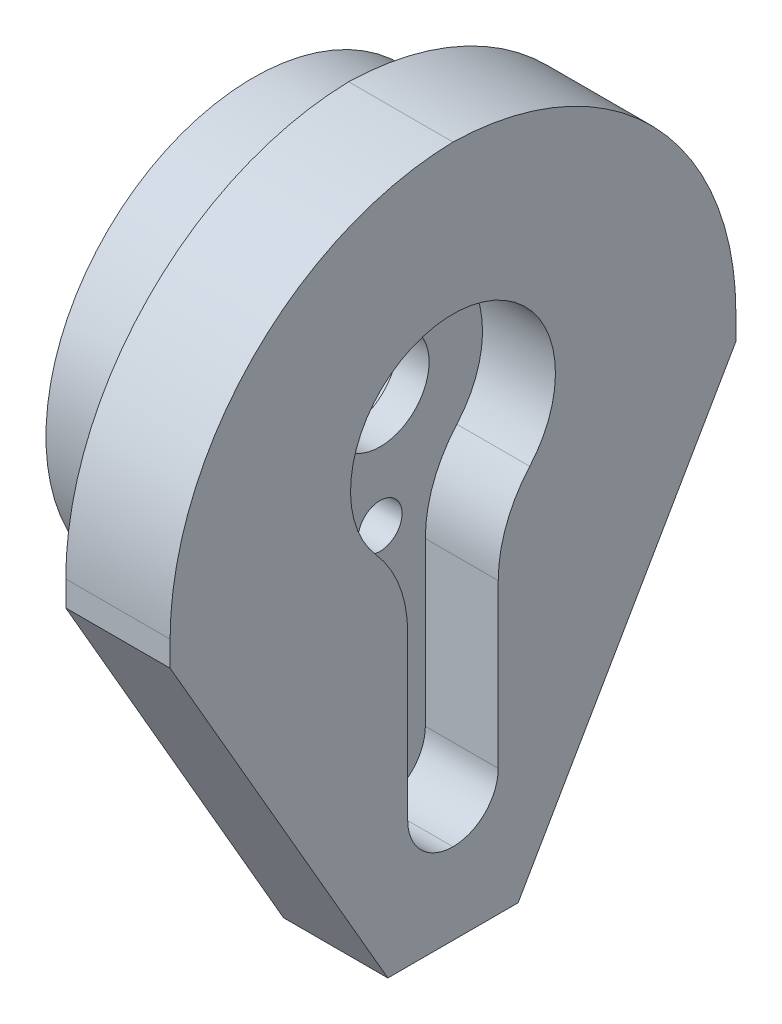
ISO-10303-21;
HEADER;
FILE_DESCRIPTION(('STEP AP214'),'2;1');
FILE_NAME('part.step','',(''),(''),'','','');
FILE_SCHEMA(('AUTOMOTIVE_DESIGN { 1 0 10303 214 1 1 1 1 }'));
ENDSEC;
DATA;
#1=APPLICATION_CONTEXT('core data for automotive mechanical design processes');
#2=APPLICATION_PROTOCOL_DEFINITION('international standard','automotive_design',2000,#1);
#3=PRODUCT_CONTEXT('',#1,'mechanical');
#4=PRODUCT('Part','Part','',(#3));
#5=PRODUCT_RELATED_PRODUCT_CATEGORY('part','',(#4));
#6=PRODUCT_DEFINITION_FORMATION('','',#4);
#7=PRODUCT_DEFINITION_CONTEXT('part definition',#1,'design');
#8=PRODUCT_DEFINITION('design','',#6,#7);
#9=PRODUCT_DEFINITION_SHAPE('','',#8);
#10=(LENGTH_UNIT() NAMED_UNIT(*) SI_UNIT(.MILLI.,.METRE.));
#11=(NAMED_UNIT(*) PLANE_ANGLE_UNIT() SI_UNIT($,.RADIAN.));
#12=(NAMED_UNIT(*) SI_UNIT($,.STERADIAN.) SOLID_ANGLE_UNIT());
#13=UNCERTAINTY_MEASURE_WITH_UNIT(LENGTH_MEASURE(1.E-05),#10,'distance_accuracy_value','');
#14=(GEOMETRIC_REPRESENTATION_CONTEXT(3) GLOBAL_UNCERTAINTY_ASSIGNED_CONTEXT((#13)) GLOBAL_UNIT_ASSIGNED_CONTEXT((#10,
#11,#12)) REPRESENTATION_CONTEXT('',''));
#15=CARTESIAN_POINT('',(0.,0.,0.));
#16=DIRECTION('',(0.,0.,1.));
#17=DIRECTION('',(1.,0.,0.));
#18=AXIS2_PLACEMENT_3D('',#15,#16,#17);
#19=CARTESIAN_POINT('',(20.,0.,0.));
#20=DIRECTION('',(1.,0.,0.));
#21=DIRECTION('',(0.,0.,-1.));
#22=AXIS2_PLACEMENT_3D('',#19,#20,#21);
#23=PLANE('',#22);
#24=CARTESIAN_POINT('',(20.,0.,0.));
#25=DIRECTION('',(1.,0.,0.));
#26=DIRECTION('',(0.,0.,-1.));
#27=AXIS2_PLACEMENT_3D('',#24,#25,#26);
#28=CIRCLE('',#27,17.475);
#29=CARTESIAN_POINT('',(20.,0.,-17.475));
#30=VERTEX_POINT('',#29);
#31=EDGE_CURVE('E11',#30,#30,#28,.T.);
#32=ORIENTED_EDGE('',*,*,#31,.T.);
#33=EDGE_LOOP('',(#32));
#34=FACE_BOUND('',#33,.T.);
#35=CARTESIAN_POINT('',(20.,-20.6,0.));
#36=DIRECTION('',(1.,0.,0.));
#37=DIRECTION('',(0.,0.,-1.));
#38=AXIS2_PLACEMENT_3D('',#35,#36,#37);
#39=CIRCLE('',#38,1.75);
#40=CARTESIAN_POINT('',(20.,-20.6,-1.75));
#41=VERTEX_POINT('',#40);
#42=EDGE_CURVE('E231',#41,#41,#39,.F.);
#43=ORIENTED_EDGE('',*,*,#42,.F.);
#44=EDGE_LOOP('',(#43));
#45=FACE_BOUND('',#44,.T.);
#46=DIRECTION('',(0.,1.,0.));
#47=VECTOR('',#46,1.);
#48=CARTESIAN_POINT('',(20.,35.,-22.5));
#49=LINE('',#48,#47);
#50=CARTESIAN_POINT('',(20.,-4.99999999999982,-22.5));
#51=VERTEX_POINT('',#50);
#52=CARTESIAN_POINT('',(20.,-3.,-22.5));
#53=VERTEX_POINT('',#52);
#54=EDGE_CURVE('E387',#51,#53,#49,.T.);
#55=ORIENTED_EDGE('',*,*,#54,.F.);
#56=DIRECTION('',(0.,0.86602540378444,-0.499999999999998));
#57=VECTOR('',#56,1.);
#58=CARTESIAN_POINT('',(20.,-4.99999999999982,-22.5));
#59=LINE('',#58,#57);
#60=CARTESIAN_POINT('',(20.,-35.,-5.17949192431122));
#61=VERTEX_POINT('',#60);
#62=EDGE_CURVE('E71',#51,#61,#59,.F.);
#63=ORIENTED_EDGE('',*,*,#62,.T.);
#64=DIRECTION('',(0.,0.,-1.));
#65=VECTOR('',#64,1.);
#66=CARTESIAN_POINT('',(20.,-35.,22.5));
#67=LINE('',#66,#65);
#68=CARTESIAN_POINT('',(20.,-35.,5.17949192431122));
#69=VERTEX_POINT('',#68);
#70=EDGE_CURVE('E191',#69,#61,#67,.T.);
#71=ORIENTED_EDGE('',*,*,#70,.F.);
#72=DIRECTION('',(0.,-0.86602540378444,-0.499999999999998));
#73=VECTOR('',#72,1.);
#74=CARTESIAN_POINT('',(20.,-35.,5.17949192431121));
#75=LINE('',#74,#73);
#76=CARTESIAN_POINT('',(20.,-4.99999999999984,22.5));
#77=VERTEX_POINT('',#76);
#78=EDGE_CURVE('E261',#69,#77,#75,.F.);
#79=ORIENTED_EDGE('',*,*,#78,.T.);
#80=DIRECTION('',(0.,-1.,0.));
#81=VECTOR('',#80,1.);
#82=CARTESIAN_POINT('',(20.,35.,22.5));
#83=LINE('',#82,#81);
#84=CARTESIAN_POINT('',(20.,-3.,22.5));
#85=VERTEX_POINT('',#84);
#86=EDGE_CURVE('E382',#85,#77,#83,.T.);
#87=ORIENTED_EDGE('',*,*,#86,.F.);
#88=CARTESIAN_POINT('',(20.,-3.,-0.500000000000001));
#89=DIRECTION('',(1.,0.,0.));
#90=DIRECTION('',(0.,0.,-1.));
#91=AXIS2_PLACEMENT_3D('',#88,#89,#90);
#92=CIRCLE('',#91,23.);
#93=CARTESIAN_POINT('',(20.,19.9945645751338,0.));
#94=VERTEX_POINT('',#93);
#95=EDGE_CURVE('E227',#85,#94,#92,.F.);
#96=ORIENTED_EDGE('',*,*,#95,.T.);
#97=CARTESIAN_POINT('',(20.,-3.,0.499999999999993));
#98=DIRECTION('',(1.,0.,0.));
#99=DIRECTION('',(0.,0.,-1.));
#100=AXIS2_PLACEMENT_3D('',#97,#98,#99);
#101=CIRCLE('',#100,23.);
#102=EDGE_CURVE('E234',#94,#53,#101,.F.);
#103=ORIENTED_EDGE('',*,*,#102,.T.);
#104=EDGE_LOOP('',(#55,#63,#71,#79,#87,#96,#103));
#105=FACE_BOUND('',#104,.T.);
#106=ADVANCED_FACE('F47',(#34,#45,#105),#23,.F.);
#107=CARTESIAN_POINT('',(28.3,35.,-22.5));
#108=DIRECTION('',(0.,0.,1.));
#109=DIRECTION('',(0.,-1.,0.));
#110=AXIS2_PLACEMENT_3D('',#107,#108,#109);
#111=PLANE('',#110);
#112=DIRECTION('',(0.,1.,0.));
#113=VECTOR('',#112,1.);
#114=CARTESIAN_POINT('',(28.3,35.,-22.5));
#115=LINE('',#114,#113);
#116=CARTESIAN_POINT('',(28.3,-4.99999999999982,-22.5));
#117=VERTEX_POINT('',#116);
#118=CARTESIAN_POINT('',(28.3,-3.,-22.5));
#119=VERTEX_POINT('',#118);
#120=EDGE_CURVE('E373',#117,#119,#115,.T.);
#121=ORIENTED_EDGE('',*,*,#120,.F.);
#122=DIRECTION('',(-1.,0.,0.));
#123=VECTOR('',#122,1.);
#124=CARTESIAN_POINT('',(28.3,-4.99999999999982,-22.5));
#125=LINE('',#124,#123);
#126=EDGE_CURVE('E270',#117,#51,#125,.T.);
#127=ORIENTED_EDGE('',*,*,#126,.T.);
#128=ORIENTED_EDGE('',*,*,#54,.T.);
#129=DIRECTION('',(-1.,0.,0.));
#130=VECTOR('',#129,1.);
#131=CARTESIAN_POINT('',(28.3,-3.,-22.5));
#132=LINE('',#131,#130);
#133=EDGE_CURVE('E238',#53,#119,#132,.F.);
#134=ORIENTED_EDGE('',*,*,#133,.T.);
#135=EDGE_LOOP('',(#121,#127,#128,#134));
#136=FACE_BOUND('',#135,.T.);
#137=ADVANCED_FACE('F305',(#136),#111,.F.);
#138=CARTESIAN_POINT('',(28.3,35.,22.5));
#139=DIRECTION('',(0.,0.,-1.));
#140=DIRECTION('',(0.,1.,0.));
#141=AXIS2_PLACEMENT_3D('',#138,#139,#140);
#142=PLANE('',#141);
#143=ORIENTED_EDGE('',*,*,#86,.T.);
#144=DIRECTION('',(1.,0.,0.));
#145=VECTOR('',#144,1.);
#146=CARTESIAN_POINT('',(28.3,-4.99999999999984,22.5));
#147=LINE('',#146,#145);
#148=CARTESIAN_POINT('',(28.3,-4.99999999999984,22.5));
#149=VERTEX_POINT('',#148);
#150=EDGE_CURVE('E264',#77,#149,#147,.T.);
#151=ORIENTED_EDGE('',*,*,#150,.T.);
#152=DIRECTION('',(0.,-1.,0.));
#153=VECTOR('',#152,1.);
#154=CARTESIAN_POINT('',(28.3,35.,22.5));
#155=LINE('',#154,#153);
#156=CARTESIAN_POINT('',(28.3,-3.,22.5));
#157=VERTEX_POINT('',#156);
#158=EDGE_CURVE('E188',#157,#149,#155,.T.);
#159=ORIENTED_EDGE('',*,*,#158,.F.);
#160=DIRECTION('',(1.,0.,0.));
#161=VECTOR('',#160,1.);
#162=CARTESIAN_POINT('',(20.,-3.,22.5));
#163=LINE('',#162,#161);
#164=EDGE_CURVE('E248',#157,#85,#163,.F.);
#165=ORIENTED_EDGE('',*,*,#164,.T.);
#166=EDGE_LOOP('',(#143,#151,#159,#165));
#167=FACE_BOUND('',#166,.T.);
#168=ADVANCED_FACE('F313',(#167),#142,.F.);
#169=CARTESIAN_POINT('',(28.3,0.,0.));
#170=DIRECTION('',(1.,0.,0.));
#171=DIRECTION('',(0.,0.,-1.));
#172=AXIS2_PLACEMENT_3D('',#169,#170,#171);
#173=PLANE('',#172);
#174=DIRECTION('',(0.,-1.,0.));
#175=VECTOR('',#174,1.);
#176=CARTESIAN_POINT('',(28.3,-28.55,3.60000000000001));
#177=LINE('',#176,#175);
#178=CARTESIAN_POINT('',(28.3,-12.0192553845902,3.6));
#179=VERTEX_POINT('',#178);
#180=CARTESIAN_POINT('',(28.3,-24.95,3.60000000000001));
#181=VERTEX_POINT('',#180);
#182=EDGE_CURVE('E152',#179,#181,#177,.T.);
#183=ORIENTED_EDGE('',*,*,#182,.F.);
#184=CARTESIAN_POINT('',(28.3,-12.0192553845902,13.6));
#185=DIRECTION('',(1.,0.,0.));
#186=DIRECTION('',(0.,0.,-1.));
#187=AXIS2_PLACEMENT_3D('',#184,#185,#186);
#188=CIRCLE('',#187,10.);
#189=CARTESIAN_POINT('',(28.3,-5.39707610933388,6.1068870523416));
#190=VERTEX_POINT('',#189);
#191=EDGE_CURVE('E208',#179,#190,#188,.T.);
#192=ORIENTED_EDGE('',*,*,#191,.T.);
#193=CARTESIAN_POINT('',(28.3,0.,0.));
#194=DIRECTION('',(1.,0.,0.));
#195=DIRECTION('',(0.,0.,-1.));
#196=AXIS2_PLACEMENT_3D('',#193,#194,#195);
#197=CIRCLE('',#196,8.15);
#198=CARTESIAN_POINT('',(28.3,-5.39707610933388,-6.1068870523416));
#199=VERTEX_POINT('',#198);
#200=EDGE_CURVE('E384',#199,#190,#197,.T.);
#201=ORIENTED_EDGE('',*,*,#200,.F.);
#202=CARTESIAN_POINT('',(28.3,-12.0192553845902,-13.6));
#203=DIRECTION('',(1.,0.,0.));
#204=DIRECTION('',(0.,0.,-1.));
#205=AXIS2_PLACEMENT_3D('',#202,#203,#204);
#206=CIRCLE('',#205,10.);
#207=CARTESIAN_POINT('',(28.3,-12.0192553845902,-3.6));
#208=VERTEX_POINT('',#207);
#209=EDGE_CURVE('E205',#199,#208,#206,.T.);
#210=ORIENTED_EDGE('',*,*,#209,.T.);
#211=DIRECTION('',(0.,1.,0.));
#212=VECTOR('',#211,1.);
#213=CARTESIAN_POINT('',(28.3,-28.55,-3.59999999999999));
#214=LINE('',#213,#212);
#215=CARTESIAN_POINT('',(28.3,-24.95,-3.59999999999999));
#216=VERTEX_POINT('',#215);
#217=EDGE_CURVE('E162',#216,#208,#214,.T.);
#218=ORIENTED_EDGE('',*,*,#217,.F.);
#219=CARTESIAN_POINT('',(28.3,-24.95,0.));
#220=DIRECTION('',(1.,0.,0.));
#221=DIRECTION('',(0.,0.,-1.));
#222=AXIS2_PLACEMENT_3D('',#219,#220,#221);
#223=CIRCLE('',#222,3.6);
#224=CARTESIAN_POINT('',(28.3,-28.55,0.));
#225=VERTEX_POINT('',#224);
#226=EDGE_CURVE('E171',#216,#225,#223,.F.);
#227=ORIENTED_EDGE('',*,*,#226,.T.);
#228=CARTESIAN_POINT('',(28.3,-24.95,0.));
#229=DIRECTION('',(1.,0.,0.));
#230=DIRECTION('',(0.,0.,-1.));
#231=AXIS2_PLACEMENT_3D('',#228,#229,#230);
#232=CIRCLE('',#231,3.6);
#233=EDGE_CURVE('E166',#225,#181,#232,.F.);
#234=ORIENTED_EDGE('',*,*,#233,.T.);
#235=EDGE_LOOP('',(#183,#192,#201,#210,#218,#227,#234));
#236=FACE_BOUND('',#235,.T.);
#237=DIRECTION('',(0.,0.,-1.));
#238=VECTOR('',#237,1.);
#239=CARTESIAN_POINT('',(28.3,-35.,22.5));
#240=LINE('',#239,#238);
#241=CARTESIAN_POINT('',(28.3,-35.,5.17949192431122));
#242=VERTEX_POINT('',#241);
#243=CARTESIAN_POINT('',(28.3,-35.,-5.17949192431122));
#244=VERTEX_POINT('',#243);
#245=EDGE_CURVE('E183',#242,#244,#240,.T.);
#246=ORIENTED_EDGE('',*,*,#245,.T.);
#247=DIRECTION('',(0.,-0.86602540378444,0.499999999999998));
#248=VECTOR('',#247,1.);
#249=CARTESIAN_POINT('',(28.3,-10.9927857925748,-19.0400635094611));
#250=LINE('',#249,#248);
#251=EDGE_CURVE('E278',#244,#117,#250,.F.);
#252=ORIENTED_EDGE('',*,*,#251,.T.);
#253=ORIENTED_EDGE('',*,*,#120,.T.);
#254=CARTESIAN_POINT('',(28.3,-3.,0.499999999999993));
#255=DIRECTION('',(1.,0.,0.));
#256=DIRECTION('',(0.,0.,-1.));
#257=AXIS2_PLACEMENT_3D('',#254,#255,#256);
#258=CIRCLE('',#257,23.);
#259=CARTESIAN_POINT('',(28.3,19.9945645751338,0.));
#260=VERTEX_POINT('',#259);
#261=EDGE_CURVE('E245',#119,#260,#258,.T.);
#262=ORIENTED_EDGE('',*,*,#261,.T.);
#263=CARTESIAN_POINT('',(28.3,-3.,-0.500000000000001));
#264=DIRECTION('',(1.,0.,0.));
#265=DIRECTION('',(0.,0.,-1.));
#266=AXIS2_PLACEMENT_3D('',#263,#264,#265);
#267=CIRCLE('',#266,23.);
#268=EDGE_CURVE('E242',#260,#157,#267,.T.);
#269=ORIENTED_EDGE('',*,*,#268,.T.);
#270=ORIENTED_EDGE('',*,*,#158,.T.);
#271=DIRECTION('',(0.,0.86602540378444,0.499999999999998));
#272=VECTOR('',#271,1.);
#273=CARTESIAN_POINT('',(28.3,-10.9927857925749,19.0400635094611));
#274=LINE('',#273,#272);
#275=EDGE_CURVE('E267',#149,#242,#274,.F.);
#276=ORIENTED_EDGE('',*,*,#275,.T.);
#277=EDGE_LOOP('',(#246,#252,#253,#262,#269,#270,#276));
#278=FACE_BOUND('',#277,.T.);
#279=ADVANCED_FACE('F167',(#236,#278),#173,.T.);
#280=CARTESIAN_POINT('',(28.3,-35.,22.5));
#281=DIRECTION('',(0.,1.,0.));
#282=DIRECTION('',(0.,0.,1.));
#283=AXIS2_PLACEMENT_3D('',#280,#281,#282);
#284=PLANE('',#283);
#285=ORIENTED_EDGE('',*,*,#70,.T.);
#286=DIRECTION('',(1.,0.,0.));
#287=VECTOR('',#286,1.);
#288=CARTESIAN_POINT('',(28.3,-35.,-5.17949192431123));
#289=LINE('',#288,#287);
#290=EDGE_CURVE('E63',#61,#244,#289,.T.);
#291=ORIENTED_EDGE('',*,*,#290,.T.);
#292=ORIENTED_EDGE('',*,*,#245,.F.);
#293=DIRECTION('',(-1.,0.,0.));
#294=VECTOR('',#293,1.);
#295=CARTESIAN_POINT('',(28.3,-35.,5.17949192431121));
#296=LINE('',#295,#294);
#297=EDGE_CURVE('E251',#242,#69,#296,.T.);
#298=ORIENTED_EDGE('',*,*,#297,.T.);
#299=EDGE_LOOP('',(#285,#291,#292,#298));
#300=FACE_BOUND('',#299,.T.);
#301=ADVANCED_FACE('F320',(#300),#284,.F.);
#302=CARTESIAN_POINT('',(22.5,-28.55,3.60000000000001));
#303=DIRECTION('',(0.,0.,1.));
#304=DIRECTION('',(0.,-1.,0.));
#305=AXIS2_PLACEMENT_3D('',#302,#303,#304);
#306=PLANE('',#305);
#307=DIRECTION('',(0.,-1.,0.));
#308=VECTOR('',#307,1.);
#309=CARTESIAN_POINT('',(22.5,-28.55,3.60000000000001));
#310=LINE('',#309,#308);
#311=CARTESIAN_POINT('',(22.5,-12.0192553845902,3.6));
#312=VERTEX_POINT('',#311);
#313=CARTESIAN_POINT('',(22.5,-24.95,3.60000000000001));
#314=VERTEX_POINT('',#313);
#315=EDGE_CURVE('E409',#312,#314,#310,.T.);
#316=ORIENTED_EDGE('',*,*,#315,.F.);
#317=DIRECTION('',(1.,0.,0.));
#318=VECTOR('',#317,1.);
#319=CARTESIAN_POINT('',(22.5,-12.0192553845902,3.6));
#320=LINE('',#319,#318);
#321=EDGE_CURVE('E159',#312,#179,#320,.T.);
#322=ORIENTED_EDGE('',*,*,#321,.T.);
#323=ORIENTED_EDGE('',*,*,#182,.T.);
#324=DIRECTION('',(1.,0.,0.));
#325=VECTOR('',#324,1.);
#326=CARTESIAN_POINT('',(22.5,-24.95,3.60000000000001));
#327=LINE('',#326,#325);
#328=EDGE_CURVE('E157',#181,#314,#327,.F.);
#329=ORIENTED_EDGE('',*,*,#328,.T.);
#330=EDGE_LOOP('',(#316,#322,#323,#329));
#331=FACE_BOUND('',#330,.T.);
#332=ADVANCED_FACE('F155',(#331),#306,.F.);
#333=CARTESIAN_POINT('',(22.5,0.,0.));
#334=DIRECTION('',(1.,0.,0.));
#335=DIRECTION('',(0.,0.,-1.));
#336=AXIS2_PLACEMENT_3D('',#333,#334,#335);
#337=CYLINDRICAL_SURFACE('',#336,8.15);
#338=ORIENTED_EDGE('',*,*,#200,.T.);
#339=DIRECTION('',(1.,0.,0.));
#340=VECTOR('',#339,1.);
#341=CARTESIAN_POINT('',(22.5,-5.39707610933388,6.1068870523416));
#342=LINE('',#341,#340);
#343=CARTESIAN_POINT('',(22.5,-5.39707610933388,6.1068870523416));
#344=VERTEX_POINT('',#343);
#345=EDGE_CURVE('E215',#190,#344,#342,.F.);
#346=ORIENTED_EDGE('',*,*,#345,.T.);
#347=CARTESIAN_POINT('',(22.5,0.,0.));
#348=DIRECTION('',(1.,0.,0.));
#349=DIRECTION('',(0.,0.,-1.));
#350=AXIS2_PLACEMENT_3D('',#347,#348,#349);
#351=CIRCLE('',#350,8.15);
#352=CARTESIAN_POINT('',(22.5,-5.39707610933388,-6.1068870523416));
#353=VERTEX_POINT('',#352);
#354=EDGE_CURVE('E389',#353,#344,#351,.T.);
#355=ORIENTED_EDGE('',*,*,#354,.F.);
#356=DIRECTION('',(1.,0.,0.));
#357=VECTOR('',#356,1.);
#358=CARTESIAN_POINT('',(22.5,-5.39707610933388,-6.1068870523416));
#359=LINE('',#358,#357);
#360=EDGE_CURVE('E211',#353,#199,#359,.T.);
#361=ORIENTED_EDGE('',*,*,#360,.T.);
#362=EDGE_LOOP('',(#338,#346,#355,#361));
#363=FACE_BOUND('',#362,.T.);
#364=ADVANCED_FACE('F467',(#363),#337,.F.);
#365=CARTESIAN_POINT('',(22.5,-28.55,-3.59999999999999));
#366=DIRECTION('',(0.,0.,-1.));
#367=DIRECTION('',(0.,1.,0.));
#368=AXIS2_PLACEMENT_3D('',#365,#366,#367);
#369=PLANE('',#368);
#370=ORIENTED_EDGE('',*,*,#217,.T.);
#371=DIRECTION('',(1.,0.,0.));
#372=VECTOR('',#371,1.);
#373=CARTESIAN_POINT('',(22.5,-12.0192553845902,-3.6));
#374=LINE('',#373,#372);
#375=CARTESIAN_POINT('',(22.5,-12.0192553845902,-3.6));
#376=VERTEX_POINT('',#375);
#377=EDGE_CURVE('E218',#208,#376,#374,.F.);
#378=ORIENTED_EDGE('',*,*,#377,.T.);
#379=DIRECTION('',(0.,1.,0.));
#380=VECTOR('',#379,1.);
#381=CARTESIAN_POINT('',(22.5,-28.55,-3.59999999999999));
#382=LINE('',#381,#380);
#383=CARTESIAN_POINT('',(22.5,-24.95,-3.59999999999999));
#384=VERTEX_POINT('',#383);
#385=EDGE_CURVE('E405',#384,#376,#382,.T.);
#386=ORIENTED_EDGE('',*,*,#385,.F.);
#387=DIRECTION('',(1.,0.,0.));
#388=VECTOR('',#387,1.);
#389=CARTESIAN_POINT('',(28.3,-24.95,-3.59999999999999));
#390=LINE('',#389,#388);
#391=EDGE_CURVE('E176',#384,#216,#390,.T.);
#392=ORIENTED_EDGE('',*,*,#391,.T.);
#393=EDGE_LOOP('',(#370,#378,#386,#392));
#394=FACE_BOUND('',#393,.T.);
#395=ADVANCED_FACE('F465',(#394),#369,.F.);
#396=CARTESIAN_POINT('',(22.5,0.,0.));
#397=DIRECTION('',(1.,0.,0.));
#398=DIRECTION('',(0.,0.,-1.));
#399=AXIS2_PLACEMENT_3D('',#396,#397,#398);
#400=PLANE('',#399);
#401=CARTESIAN_POINT('',(22.5,-20.6,0.));
#402=DIRECTION('',(1.,0.,0.));
#403=DIRECTION('',(0.,0.,-1.));
#404=AXIS2_PLACEMENT_3D('',#401,#402,#403);
#405=CIRCLE('',#404,1.75);
#406=CARTESIAN_POINT('',(22.5,-20.6,-1.75));
#407=VERTEX_POINT('',#406);
#408=EDGE_CURVE('E419',#407,#407,#405,.T.);
#409=ORIENTED_EDGE('',*,*,#408,.F.);
#410=EDGE_LOOP('',(#409));
#411=FACE_BOUND('',#410,.T.);
#412=CARTESIAN_POINT('',(22.5,-9.35,0.));
#413=DIRECTION('',(1.,0.,0.));
#414=DIRECTION('',(0.,0.,-1.));
#415=AXIS2_PLACEMENT_3D('',#412,#413,#414);
#416=CIRCLE('',#415,1.75);
#417=CARTESIAN_POINT('',(22.5,-9.35,-1.75));
#418=VERTEX_POINT('',#417);
#419=EDGE_CURVE('E423',#418,#418,#416,.T.);
#420=ORIENTED_EDGE('',*,*,#419,.F.);
#421=EDGE_LOOP('',(#420));
#422=FACE_BOUND('',#421,.T.);
#423=CARTESIAN_POINT('',(22.5,0.,0.));
#424=DIRECTION('',(1.,0.,0.));
#425=DIRECTION('',(0.,0.,-1.));
#426=AXIS2_PLACEMENT_3D('',#423,#424,#425);
#427=CIRCLE('',#426,3.9);
#428=CARTESIAN_POINT('',(22.5,0.,-3.9));
#429=VERTEX_POINT('',#428);
#430=EDGE_CURVE('E202',#429,#429,#427,.T.);
#431=ORIENTED_EDGE('',*,*,#430,.F.);
#432=EDGE_LOOP('',(#431));
#433=FACE_BOUND('',#432,.T.);
#434=ORIENTED_EDGE('',*,*,#354,.T.);
#435=CARTESIAN_POINT('',(22.5,-12.0192553845902,13.6));
#436=DIRECTION('',(1.,0.,0.));
#437=DIRECTION('',(0.,0.,-1.));
#438=AXIS2_PLACEMENT_3D('',#435,#436,#437);
#439=CIRCLE('',#438,10.);
#440=EDGE_CURVE('E221',#344,#312,#439,.F.);
#441=ORIENTED_EDGE('',*,*,#440,.T.);
#442=ORIENTED_EDGE('',*,*,#315,.T.);
#443=CARTESIAN_POINT('',(22.5,-24.95,0.));
#444=DIRECTION('',(1.,0.,0.));
#445=DIRECTION('',(0.,0.,-1.));
#446=AXIS2_PLACEMENT_3D('',#443,#444,#445);
#447=CIRCLE('',#446,3.6);
#448=CARTESIAN_POINT('',(22.5,-28.55,0.));
#449=VERTEX_POINT('',#448);
#450=EDGE_CURVE('E180',#314,#449,#447,.T.);
#451=ORIENTED_EDGE('',*,*,#450,.T.);
#452=CARTESIAN_POINT('',(22.5,-24.95,0.));
#453=DIRECTION('',(1.,0.,0.));
#454=DIRECTION('',(0.,0.,-1.));
#455=AXIS2_PLACEMENT_3D('',#452,#453,#454);
#456=CIRCLE('',#455,3.6);
#457=EDGE_CURVE('E182',#449,#384,#456,.T.);
#458=ORIENTED_EDGE('',*,*,#457,.T.);
#459=ORIENTED_EDGE('',*,*,#385,.T.);
#460=CARTESIAN_POINT('',(22.5,-12.0192553845902,-13.6));
#461=DIRECTION('',(1.,0.,0.));
#462=DIRECTION('',(0.,0.,-1.));
#463=AXIS2_PLACEMENT_3D('',#460,#461,#462);
#464=CIRCLE('',#463,10.);
#465=EDGE_CURVE('E224',#376,#353,#464,.F.);
#466=ORIENTED_EDGE('',*,*,#465,.T.);
#467=EDGE_LOOP('',(#434,#441,#442,#451,#458,#459,#466));
#468=FACE_BOUND('',#467,.T.);
#469=ADVANCED_FACE('F332',(#411,#422,#433,#468),#400,.T.);
#470=CARTESIAN_POINT('',(22.5,-24.95,0.));
#471=DIRECTION('',(-1.,0.,0.));
#472=DIRECTION('',(0.,0.,1.));
#473=AXIS2_PLACEMENT_3D('',#470,#471,#472);
#474=CYLINDRICAL_SURFACE('',#473,3.6);
#475=ORIENTED_EDGE('',*,*,#391,.F.);
#476=ORIENTED_EDGE('',*,*,#457,.F.);
#477=DIRECTION('',(1.,0.,0.));
#478=VECTOR('',#477,1.);
#479=CARTESIAN_POINT('',(22.5,-28.55,0.));
#480=LINE('',#479,#478);
#481=EDGE_CURVE('E163',#225,#449,#480,.F.);
#482=ORIENTED_EDGE('',*,*,#481,.F.);
#483=ORIENTED_EDGE('',*,*,#226,.F.);
#484=EDGE_LOOP('',(#475,#476,#482,#483));
#485=FACE_BOUND('',#484,.T.);
#486=ADVANCED_FACE('F329',(#485),#474,.F.);
#487=CARTESIAN_POINT('',(22.5,-24.95,0.));
#488=DIRECTION('',(-1.,0.,0.));
#489=DIRECTION('',(0.,0.,1.));
#490=AXIS2_PLACEMENT_3D('',#487,#488,#489);
#491=CYLINDRICAL_SURFACE('',#490,3.6);
#492=ORIENTED_EDGE('',*,*,#450,.F.);
#493=ORIENTED_EDGE('',*,*,#328,.F.);
#494=ORIENTED_EDGE('',*,*,#233,.F.);
#495=ORIENTED_EDGE('',*,*,#481,.T.);
#496=EDGE_LOOP('',(#492,#493,#494,#495));
#497=FACE_BOUND('',#496,.T.);
#498=ADVANCED_FACE('F179',(#497),#491,.F.);
#499=CARTESIAN_POINT('',(22.5,-12.0192553845902,13.6));
#500=DIRECTION('',(1.,0.,0.));
#501=DIRECTION('',(0.,0.,-1.));
#502=AXIS2_PLACEMENT_3D('',#499,#500,#501);
#503=CYLINDRICAL_SURFACE('',#502,10.);
#504=ORIENTED_EDGE('',*,*,#440,.F.);
#505=ORIENTED_EDGE('',*,*,#345,.F.);
#506=ORIENTED_EDGE('',*,*,#191,.F.);
#507=ORIENTED_EDGE('',*,*,#321,.F.);
#508=EDGE_LOOP('',(#504,#505,#506,#507));
#509=FACE_BOUND('',#508,.T.);
#510=ADVANCED_FACE('F328',(#509),#503,.T.);
#511=CARTESIAN_POINT('',(22.5,-12.0192553845902,-13.6));
#512=DIRECTION('',(1.,0.,0.));
#513=DIRECTION('',(0.,0.,-1.));
#514=AXIS2_PLACEMENT_3D('',#511,#512,#513);
#515=CYLINDRICAL_SURFACE('',#514,10.);
#516=ORIENTED_EDGE('',*,*,#465,.F.);
#517=ORIENTED_EDGE('',*,*,#377,.F.);
#518=ORIENTED_EDGE('',*,*,#209,.F.);
#519=ORIENTED_EDGE('',*,*,#360,.F.);
#520=EDGE_LOOP('',(#516,#517,#518,#519));
#521=FACE_BOUND('',#520,.T.);
#522=ADVANCED_FACE('F336',(#521),#515,.T.);
#523=CARTESIAN_POINT('',(28.3,0.,0.));
#524=DIRECTION('',(-1.,0.,0.));
#525=DIRECTION('',(0.,0.,1.));
#526=AXIS2_PLACEMENT_3D('',#523,#524,#525);
#527=CYLINDRICAL_SURFACE('',#526,3.9);
#528=CARTESIAN_POINT('',(20.,0.,0.));
#529=DIRECTION('',(-1.,0.,0.));
#530=DIRECTION('',(0.,0.,1.));
#531=AXIS2_PLACEMENT_3D('',#528,#529,#530);
#532=CIRCLE('',#531,3.9);
#533=CARTESIAN_POINT('',(20.,0.,3.9));
#534=VERTEX_POINT('',#533);
#535=EDGE_CURVE('E433',#534,#534,#532,.F.);
#536=ORIENTED_EDGE('',*,*,#535,.F.);
#537=EDGE_LOOP('',(#536));
#538=FACE_BOUND('',#537,.T.);
#539=ORIENTED_EDGE('',*,*,#430,.T.);
#540=EDGE_LOOP('',(#539));
#541=FACE_BOUND('',#540,.T.);
#542=ADVANCED_FACE('F340',(#538,#541),#527,.F.);
#543=CARTESIAN_POINT('',(-0.001000000000001,-9.35,0.));
#544=DIRECTION('',(1.,0.,0.));
#545=DIRECTION('',(0.,0.,-1.));
#546=AXIS2_PLACEMENT_3D('',#543,#544,#545);
#547=CYLINDRICAL_SURFACE('',#546,1.75);
#548=CARTESIAN_POINT('',(20.,-9.35,0.));
#549=DIRECTION('',(-1.,0.,0.));
#550=DIRECTION('',(0.,0.,1.));
#551=AXIS2_PLACEMENT_3D('',#548,#549,#550);
#552=CIRCLE('',#551,1.75);
#553=CARTESIAN_POINT('',(20.,-9.35,-1.75));
#554=VERTEX_POINT('',#553);
#555=EDGE_CURVE('E257',#554,#554,#552,.F.);
#556=CARTESIAN_POINT('',(22.5,-9.35,-1.75));
#557=CARTESIAN_POINT('',(22.4739583333333,-9.35,-1.75));
#558=CARTESIAN_POINT('',(22.4479166666667,-9.35,-1.75));
#559=CARTESIAN_POINT('',(22.3958333333333,-9.35,-1.75));
#560=CARTESIAN_POINT('',(22.3697916666667,-9.35,-1.75));
#561=CARTESIAN_POINT('',(22.3177083333333,-9.35,-1.75));
#562=CARTESIAN_POINT('',(22.2916666666667,-9.35,-1.75));
#563=CARTESIAN_POINT('',(22.2395833333333,-9.35,-1.75));
#564=CARTESIAN_POINT('',(22.2135416666667,-9.35,-1.75));
#565=CARTESIAN_POINT('',(22.1614583333333,-9.35,-1.75));
#566=CARTESIAN_POINT('',(22.1354166666667,-9.35,-1.75));
#567=CARTESIAN_POINT('',(22.0833333333333,-9.35,-1.75));
#568=CARTESIAN_POINT('',(22.0572916666667,-9.35,-1.75));
#569=CARTESIAN_POINT('',(22.0052083333333,-9.35,-1.75));
#570=CARTESIAN_POINT('',(21.9791666666667,-9.35,-1.75));
#571=CARTESIAN_POINT('',(21.9270833333333,-9.35,-1.75));
#572=CARTESIAN_POINT('',(21.9010416666667,-9.35,-1.75));
#573=CARTESIAN_POINT('',(21.8489583333333,-9.35,-1.75));
#574=CARTESIAN_POINT('',(21.8229166666667,-9.35,-1.75));
#575=CARTESIAN_POINT('',(21.7708333333333,-9.35,-1.75));
#576=CARTESIAN_POINT('',(21.7447916666667,-9.35,-1.75));
#577=CARTESIAN_POINT('',(21.6927083333333,-9.35,-1.75));
#578=CARTESIAN_POINT('',(21.6666666666667,-9.35,-1.75));
#579=CARTESIAN_POINT('',(21.6145833333333,-9.35,-1.75));
#580=CARTESIAN_POINT('',(21.5885416666667,-9.35,-1.75));
#581=CARTESIAN_POINT('',(21.5364583333333,-9.35,-1.75));
#582=CARTESIAN_POINT('',(21.5104166666667,-9.35,-1.75));
#583=CARTESIAN_POINT('',(21.4583333333333,-9.35,-1.75));
#584=CARTESIAN_POINT('',(21.4322916666667,-9.35,-1.75));
#585=CARTESIAN_POINT('',(21.3802083333333,-9.35,-1.75));
#586=CARTESIAN_POINT('',(21.3541666666667,-9.35,-1.75));
#587=CARTESIAN_POINT('',(21.3020833333333,-9.35,-1.75));
#588=CARTESIAN_POINT('',(21.2760416666667,-9.35,-1.75));
#589=CARTESIAN_POINT('',(21.2239583333333,-9.35,-1.75));
#590=CARTESIAN_POINT('',(21.1979166666667,-9.35,-1.75));
#591=CARTESIAN_POINT('',(21.1458333333333,-9.35,-1.75));
#592=CARTESIAN_POINT('',(21.1197916666667,-9.35,-1.75));
#593=CARTESIAN_POINT('',(21.0677083333333,-9.35,-1.75));
#594=CARTESIAN_POINT('',(21.0416666666667,-9.35,-1.75));
#595=CARTESIAN_POINT('',(20.9895833333333,-9.35,-1.75));
#596=CARTESIAN_POINT('',(20.9635416666667,-9.35,-1.75));
#597=CARTESIAN_POINT('',(20.9114583333333,-9.35,-1.75));
#598=CARTESIAN_POINT('',(20.8854166666667,-9.35,-1.75));
#599=CARTESIAN_POINT('',(20.8333333333333,-9.35,-1.75));
#600=CARTESIAN_POINT('',(20.8072916666667,-9.35,-1.75));
#601=CARTESIAN_POINT('',(20.7552083333333,-9.35,-1.75));
#602=CARTESIAN_POINT('',(20.7291666666667,-9.35,-1.75));
#603=CARTESIAN_POINT('',(20.6770833333333,-9.35,-1.75));
#604=CARTESIAN_POINT('',(20.6510416666667,-9.35,-1.75));
#605=CARTESIAN_POINT('',(20.5989583333333,-9.35,-1.75));
#606=CARTESIAN_POINT('',(20.5729166666667,-9.35,-1.75));
#607=CARTESIAN_POINT('',(20.5208333333333,-9.35,-1.75));
#608=CARTESIAN_POINT('',(20.4947916666667,-9.35,-1.75));
#609=CARTESIAN_POINT('',(20.4427083333333,-9.35,-1.75));
#610=CARTESIAN_POINT('',(20.4166666666667,-9.35,-1.75));
#611=CARTESIAN_POINT('',(20.3645833333333,-9.35,-1.75));
#612=CARTESIAN_POINT('',(20.3385416666667,-9.35,-1.75));
#613=CARTESIAN_POINT('',(20.2864583333333,-9.35,-1.75));
#614=CARTESIAN_POINT('',(20.2604166666667,-9.35,-1.75));
#615=CARTESIAN_POINT('',(20.2083333333333,-9.35,-1.75));
#616=CARTESIAN_POINT('',(20.1822916666667,-9.35,-1.75));
#617=CARTESIAN_POINT('',(20.1302083333333,-9.35,-1.75));
#618=CARTESIAN_POINT('',(20.1041666666667,-9.35,-1.75));
#619=CARTESIAN_POINT('',(20.0520833333333,-9.35,-1.75));
#620=CARTESIAN_POINT('',(20.0260416666667,-9.35,-1.75));
#621=CARTESIAN_POINT('',(20.,-9.35,-1.75));
#622=B_SPLINE_CURVE_WITH_KNOTS('',3,(#556,#557,#558,#559,#560,#561,#562,#563,#564,#565,#566,
#567,#568,#569,#570,#571,#572,#573,#574,#575,#576,#577,#578,#579,#580,#581,#582,#583,#584,#585,
#586,#587,#588,#589,#590,#591,#592,#593,#594,#595,#596,#597,#598,#599,#600,#601,#602,#603,#604,
#605,#606,#607,#608,#609,#610,#611,#612,#613,#614,#615,#616,#617,#618,#619,#620,#621),
.UNSPECIFIED.,.F.,.F.,(4,2,2,2,2,2,2,2,2,2,2,2,2,2,2,2,2,2,2,2,2,2,2,2,2,2,2,2,2,2,2,2,4),(0.,
0.0781249999999983,0.15625,0.234374999999998,0.3125,0.390624999999999,0.46875,0.546874999999999,
0.625000000000001,0.703124999999999,0.781249999999997,0.859374999999999,0.937499999999997,
1.015625,1.09375,1.171875,1.25,1.328125,1.40625,1.484375,1.5625,1.640625,1.71875,1.796875,
1.87499999999999,1.953125,2.03124999999999,2.109375,2.1875,2.265625,2.34375,2.421875,2.5),.UNSPECIFIED.);
#623=EDGE_CURVE('BSEAM452',#418,#554,#622,.T.);
#624=ORIENTED_EDGE('',*,*,#419,.T.);
#625=ORIENTED_EDGE('',*,*,#555,.F.);
#626=ORIENTED_EDGE('',*,*,#623,.T.);
#627=ORIENTED_EDGE('',*,*,#623,.F.);
#628=EDGE_LOOP('',(#624,#626,#625,#627));
#629=FACE_BOUND('',#628,.T.);
#630=ADVANCED_FACE('F452',(#629),#547,.F.);
#631=CARTESIAN_POINT('',(-0.001000000000001,-20.6,0.));
#632=DIRECTION('',(1.,0.,0.));
#633=DIRECTION('',(0.,0.,-1.));
#634=AXIS2_PLACEMENT_3D('',#631,#632,#633);
#635=CYLINDRICAL_SURFACE('',#634,1.75);
#636=CARTESIAN_POINT('',(22.5,-20.6,-1.75));
#637=CARTESIAN_POINT('',(22.4739583333333,-20.6,-1.75));
#638=CARTESIAN_POINT('',(22.4479166666667,-20.6,-1.75));
#639=CARTESIAN_POINT('',(22.3958333333333,-20.6,-1.75));
#640=CARTESIAN_POINT('',(22.3697916666667,-20.6,-1.75));
#641=CARTESIAN_POINT('',(22.3177083333333,-20.6,-1.75));
#642=CARTESIAN_POINT('',(22.2916666666667,-20.6,-1.75));
#643=CARTESIAN_POINT('',(22.2395833333333,-20.6,-1.75));
#644=CARTESIAN_POINT('',(22.2135416666667,-20.6,-1.75));
#645=CARTESIAN_POINT('',(22.1614583333333,-20.6,-1.75));
#646=CARTESIAN_POINT('',(22.1354166666667,-20.6,-1.75));
#647=CARTESIAN_POINT('',(22.0833333333333,-20.6,-1.75));
#648=CARTESIAN_POINT('',(22.0572916666667,-20.6,-1.75));
#649=CARTESIAN_POINT('',(22.0052083333333,-20.6,-1.75));
#650=CARTESIAN_POINT('',(21.9791666666667,-20.6,-1.75));
#651=CARTESIAN_POINT('',(21.9270833333333,-20.6,-1.75));
#652=CARTESIAN_POINT('',(21.9010416666667,-20.6,-1.75));
#653=CARTESIAN_POINT('',(21.8489583333333,-20.6,-1.75));
#654=CARTESIAN_POINT('',(21.8229166666667,-20.6,-1.75));
#655=CARTESIAN_POINT('',(21.7708333333333,-20.6,-1.75));
#656=CARTESIAN_POINT('',(21.7447916666667,-20.6,-1.75));
#657=CARTESIAN_POINT('',(21.6927083333333,-20.6,-1.75));
#658=CARTESIAN_POINT('',(21.6666666666667,-20.6,-1.75));
#659=CARTESIAN_POINT('',(21.6145833333333,-20.6,-1.75));
#660=CARTESIAN_POINT('',(21.5885416666667,-20.6,-1.75));
#661=CARTESIAN_POINT('',(21.5364583333333,-20.6,-1.75));
#662=CARTESIAN_POINT('',(21.5104166666667,-20.6,-1.75));
#663=CARTESIAN_POINT('',(21.4583333333333,-20.6,-1.75));
#664=CARTESIAN_POINT('',(21.4322916666667,-20.6,-1.75));
#665=CARTESIAN_POINT('',(21.3802083333333,-20.6,-1.75));
#666=CARTESIAN_POINT('',(21.3541666666667,-20.6,-1.75));
#667=CARTESIAN_POINT('',(21.3020833333333,-20.6,-1.75));
#668=CARTESIAN_POINT('',(21.2760416666667,-20.6,-1.75));
#669=CARTESIAN_POINT('',(21.2239583333333,-20.6,-1.75));
#670=CARTESIAN_POINT('',(21.1979166666667,-20.6,-1.75));
#671=CARTESIAN_POINT('',(21.1458333333333,-20.6,-1.75));
#672=CARTESIAN_POINT('',(21.1197916666667,-20.6,-1.75));
#673=CARTESIAN_POINT('',(21.0677083333333,-20.6,-1.75));
#674=CARTESIAN_POINT('',(21.0416666666667,-20.6,-1.75));
#675=CARTESIAN_POINT('',(20.9895833333333,-20.6,-1.75));
#676=CARTESIAN_POINT('',(20.9635416666667,-20.6,-1.75));
#677=CARTESIAN_POINT('',(20.9114583333333,-20.6,-1.75));
#678=CARTESIAN_POINT('',(20.8854166666667,-20.6,-1.75));
#679=CARTESIAN_POINT('',(20.8333333333333,-20.6,-1.75));
#680=CARTESIAN_POINT('',(20.8072916666667,-20.6,-1.75));
#681=CARTESIAN_POINT('',(20.7552083333333,-20.6,-1.75));
#682=CARTESIAN_POINT('',(20.7291666666667,-20.6,-1.75));
#683=CARTESIAN_POINT('',(20.6770833333333,-20.6,-1.75));
#684=CARTESIAN_POINT('',(20.6510416666667,-20.6,-1.75));
#685=CARTESIAN_POINT('',(20.5989583333333,-20.6,-1.75));
#686=CARTESIAN_POINT('',(20.5729166666667,-20.6,-1.75));
#687=CARTESIAN_POINT('',(20.5208333333333,-20.6,-1.75));
#688=CARTESIAN_POINT('',(20.4947916666667,-20.6,-1.75));
#689=CARTESIAN_POINT('',(20.4427083333333,-20.6,-1.75));
#690=CARTESIAN_POINT('',(20.4166666666667,-20.6,-1.75));
#691=CARTESIAN_POINT('',(20.3645833333333,-20.6,-1.75));
#692=CARTESIAN_POINT('',(20.3385416666667,-20.6,-1.75));
#693=CARTESIAN_POINT('',(20.2864583333333,-20.6,-1.75));
#694=CARTESIAN_POINT('',(20.2604166666667,-20.6,-1.75));
#695=CARTESIAN_POINT('',(20.2083333333333,-20.6,-1.75));
#696=CARTESIAN_POINT('',(20.1822916666667,-20.6,-1.75));
#697=CARTESIAN_POINT('',(20.1302083333333,-20.6,-1.75));
#698=CARTESIAN_POINT('',(20.1041666666667,-20.6,-1.75));
#699=CARTESIAN_POINT('',(20.0520833333333,-20.6,-1.75));
#700=CARTESIAN_POINT('',(20.0260416666667,-20.6,-1.75));
#701=CARTESIAN_POINT('',(20.,-20.6,-1.75));
#702=B_SPLINE_CURVE_WITH_KNOTS('',3,(#636,#637,#638,#639,#640,#641,#642,#643,#644,#645,#646,
#647,#648,#649,#650,#651,#652,#653,#654,#655,#656,#657,#658,#659,#660,#661,#662,#663,#664,#665,
#666,#667,#668,#669,#670,#671,#672,#673,#674,#675,#676,#677,#678,#679,#680,#681,#682,#683,#684,
#685,#686,#687,#688,#689,#690,#691,#692,#693,#694,#695,#696,#697,#698,#699,#700,#701),
.UNSPECIFIED.,.F.,.F.,(4,2,2,2,2,2,2,2,2,2,2,2,2,2,2,2,2,2,2,2,2,2,2,2,2,2,2,2,2,2,2,2,4),(0.,
0.0781249999999983,0.15625,0.234374999999998,0.3125,0.390624999999999,0.46875,0.546874999999999,
0.625000000000001,0.703124999999999,0.781249999999997,0.859374999999999,0.937499999999997,
1.015625,1.09375,1.171875,1.25,1.328125,1.40625,1.484375,1.5625,1.640625,1.71875,1.796875,
1.87499999999999,1.953125,2.03124999999999,2.109375,2.1875,2.265625,2.34375,2.421875,2.5),.UNSPECIFIED.);
#703=EDGE_CURVE('BSEAM447',#407,#41,#702,.T.);
#704=ORIENTED_EDGE('',*,*,#408,.T.);
#705=ORIENTED_EDGE('',*,*,#42,.T.);
#706=ORIENTED_EDGE('',*,*,#703,.T.);
#707=ORIENTED_EDGE('',*,*,#703,.F.);
#708=EDGE_LOOP('',(#704,#706,#705,#707));
#709=FACE_BOUND('',#708,.T.);
#710=ADVANCED_FACE('F447',(#709),#635,.F.);
#711=CARTESIAN_POINT('',(12.4,0.,0.));
#712=DIRECTION('',(1.,0.,0.));
#713=DIRECTION('',(0.,0.,-1.));
#714=AXIS2_PLACEMENT_3D('',#711,#712,#713);
#715=CYLINDRICAL_SURFACE('',#714,16.475);
#716=CARTESIAN_POINT('',(19.,0.,0.));
#717=DIRECTION('',(1.,0.,0.));
#718=DIRECTION('',(0.,0.,-1.));
#719=AXIS2_PLACEMENT_3D('',#716,#717,#718);
#720=CIRCLE('',#719,16.475);
#721=CARTESIAN_POINT('',(19.,0.,-16.475));
#722=VERTEX_POINT('',#721);
#723=EDGE_CURVE('E56',#722,#722,#720,.F.);
#724=CARTESIAN_POINT('',(12.4,0.,0.));
#725=DIRECTION('',(-1.,0.,0.));
#726=DIRECTION('',(0.,0.,1.));
#727=AXIS2_PLACEMENT_3D('',#724,#725,#726);
#728=CIRCLE('',#727,16.475);
#729=CARTESIAN_POINT('',(12.4,0.,-16.475));
#730=VERTEX_POINT('',#729);
#731=EDGE_CURVE('E256',#730,#730,#728,.T.);
#732=CARTESIAN_POINT('',(19.,0.,-16.475));
#733=CARTESIAN_POINT('',(18.93125,0.,-16.475));
#734=CARTESIAN_POINT('',(18.8625,0.,-16.475));
#735=CARTESIAN_POINT('',(18.725,0.,-16.475));
#736=CARTESIAN_POINT('',(18.65625,0.,-16.475));
#737=CARTESIAN_POINT('',(18.51875,0.,-16.475));
#738=CARTESIAN_POINT('',(18.45,0.,-16.475));
#739=CARTESIAN_POINT('',(18.3125,0.,-16.475));
#740=CARTESIAN_POINT('',(18.24375,0.,-16.475));
#741=CARTESIAN_POINT('',(18.10625,0.,-16.475));
#742=CARTESIAN_POINT('',(18.0375,0.,-16.475));
#743=CARTESIAN_POINT('',(17.9,0.,-16.475));
#744=CARTESIAN_POINT('',(17.83125,0.,-16.475));
#745=CARTESIAN_POINT('',(17.69375,0.,-16.475));
#746=CARTESIAN_POINT('',(17.625,0.,-16.475));
#747=CARTESIAN_POINT('',(17.4875,0.,-16.475));
#748=CARTESIAN_POINT('',(17.41875,0.,-16.475));
#749=CARTESIAN_POINT('',(17.28125,0.,-16.475));
#750=CARTESIAN_POINT('',(17.2125,0.,-16.475));
#751=CARTESIAN_POINT('',(17.075,0.,-16.475));
#752=CARTESIAN_POINT('',(17.00625,0.,-16.475));
#753=CARTESIAN_POINT('',(16.86875,0.,-16.475));
#754=CARTESIAN_POINT('',(16.8,0.,-16.475));
#755=CARTESIAN_POINT('',(16.6625,0.,-16.475));
#756=CARTESIAN_POINT('',(16.59375,0.,-16.475));
#757=CARTESIAN_POINT('',(16.45625,0.,-16.475));
#758=CARTESIAN_POINT('',(16.3875,0.,-16.475));
#759=CARTESIAN_POINT('',(16.25,0.,-16.475));
#760=CARTESIAN_POINT('',(16.18125,0.,-16.475));
#761=CARTESIAN_POINT('',(16.04375,0.,-16.475));
#762=CARTESIAN_POINT('',(15.975,0.,-16.475));
#763=CARTESIAN_POINT('',(15.8375,0.,-16.475));
#764=CARTESIAN_POINT('',(15.76875,0.,-16.475));
#765=CARTESIAN_POINT('',(15.63125,0.,-16.475));
#766=CARTESIAN_POINT('',(15.5625,0.,-16.475));
#767=CARTESIAN_POINT('',(15.425,0.,-16.475));
#768=CARTESIAN_POINT('',(15.35625,0.,-16.475));
#769=CARTESIAN_POINT('',(15.21875,0.,-16.475));
#770=CARTESIAN_POINT('',(15.15,0.,-16.475));
#771=CARTESIAN_POINT('',(15.0125,0.,-16.475));
#772=CARTESIAN_POINT('',(14.94375,0.,-16.475));
#773=CARTESIAN_POINT('',(14.80625,0.,-16.475));
#774=CARTESIAN_POINT('',(14.7375,0.,-16.475));
#775=CARTESIAN_POINT('',(14.6,0.,-16.475));
#776=CARTESIAN_POINT('',(14.53125,0.,-16.475));
#777=CARTESIAN_POINT('',(14.39375,0.,-16.475));
#778=CARTESIAN_POINT('',(14.325,0.,-16.475));
#779=CARTESIAN_POINT('',(14.1875,0.,-16.475));
#780=CARTESIAN_POINT('',(14.11875,0.,-16.475));
#781=CARTESIAN_POINT('',(13.98125,0.,-16.475));
#782=CARTESIAN_POINT('',(13.9125,0.,-16.475));
#783=CARTESIAN_POINT('',(13.775,0.,-16.475));
#784=CARTESIAN_POINT('',(13.70625,0.,-16.475));
#785=CARTESIAN_POINT('',(13.56875,0.,-16.475));
#786=CARTESIAN_POINT('',(13.5,0.,-16.475));
#787=CARTESIAN_POINT('',(13.3625,0.,-16.475));
#788=CARTESIAN_POINT('',(13.29375,0.,-16.475));
#789=CARTESIAN_POINT('',(13.15625,0.,-16.475));
#790=CARTESIAN_POINT('',(13.0875,0.,-16.475));
#791=CARTESIAN_POINT('',(12.95,0.,-16.475));
#792=CARTESIAN_POINT('',(12.88125,0.,-16.475));
#793=CARTESIAN_POINT('',(12.74375,0.,-16.475));
#794=CARTESIAN_POINT('',(12.675,0.,-16.475));
#795=CARTESIAN_POINT('',(12.5375,0.,-16.475));
#796=CARTESIAN_POINT('',(12.46875,0.,-16.475));
#797=CARTESIAN_POINT('',(12.4,0.,-16.475));
#798=B_SPLINE_CURVE_WITH_KNOTS('',3,(#732,#733,#734,#735,#736,#737,#738,#739,#740,#741,#742,
#743,#744,#745,#746,#747,#748,#749,#750,#751,#752,#753,#754,#755,#756,#757,#758,#759,#760,#761,
#762,#763,#764,#765,#766,#767,#768,#769,#770,#771,#772,#773,#774,#775,#776,#777,#778,#779,#780,
#781,#782,#783,#784,#785,#786,#787,#788,#789,#790,#791,#792,#793,#794,#795,#796,#797),
.UNSPECIFIED.,.F.,.F.,(4,2,2,2,2,2,2,2,2,2,2,2,2,2,2,2,2,2,2,2,2,2,2,2,2,2,2,2,2,2,2,2,4),(0.,
0.206250000000002,0.4125,0.618750000000001,0.824999999999999,1.03125,1.2375,1.44375,1.65,
1.85625,2.0625,2.26875,2.475,2.68125,2.8875,3.09375,3.3,3.50625,3.7125,3.91875,4.125,4.33125,
4.5375,4.74375,4.95,5.15625,5.3625,5.56875,5.775,5.98125,6.1875,6.39375,6.6),.UNSPECIFIED.);
#799=EDGE_CURVE('BSEAM292',#722,#730,#798,.T.);
#800=ORIENTED_EDGE('',*,*,#723,.T.);
#801=ORIENTED_EDGE('',*,*,#731,.F.);
#802=ORIENTED_EDGE('',*,*,#799,.T.);
#803=ORIENTED_EDGE('',*,*,#799,.F.);
#804=EDGE_LOOP('',(#800,#802,#801,#803));
#805=FACE_BOUND('',#804,.T.);
#806=ADVANCED_FACE('F292',(#805),#715,.T.);
#807=CARTESIAN_POINT('',(12.4,0.,0.));
#808=DIRECTION('',(-1.,0.,0.));
#809=DIRECTION('',(0.,0.,1.));
#810=AXIS2_PLACEMENT_3D('',#807,#808,#809);
#811=PLANE('',#810);
#812=CARTESIAN_POINT('',(12.4,0.,0.));
#813=DIRECTION('',(-1.,0.,0.));
#814=DIRECTION('',(0.,0.,1.));
#815=AXIS2_PLACEMENT_3D('',#812,#813,#814);
#816=CIRCLE('',#815,13.475);
#817=CARTESIAN_POINT('',(12.4,0.,13.475));
#818=VERTEX_POINT('',#817);
#819=EDGE_CURVE('E437',#818,#818,#816,.T.);
#820=ORIENTED_EDGE('',*,*,#819,.F.);
#821=EDGE_LOOP('',(#820));
#822=FACE_BOUND('',#821,.T.);
#823=ORIENTED_EDGE('',*,*,#731,.T.);
#824=EDGE_LOOP('',(#823));
#825=FACE_BOUND('',#824,.T.);
#826=ADVANCED_FACE('F350',(#822,#825),#811,.T.);
#827=CARTESIAN_POINT('',(0.,-3.,-0.500000000000001));
#828=DIRECTION('',(-1.,0.,0.));
#829=DIRECTION('',(0.,0.,1.));
#830=AXIS2_PLACEMENT_3D('',#827,#828,#829);
#831=CYLINDRICAL_SURFACE('',#830,23.);
#832=ORIENTED_EDGE('',*,*,#164,.F.);
#833=ORIENTED_EDGE('',*,*,#268,.F.);
#834=DIRECTION('',(-1.,0.,0.));
#835=VECTOR('',#834,1.);
#836=CARTESIAN_POINT('',(24.15,19.9945645751338,0.));
#837=LINE('',#836,#835);
#838=EDGE_CURVE('E252',#94,#260,#837,.F.);
#839=ORIENTED_EDGE('',*,*,#838,.F.);
#840=ORIENTED_EDGE('',*,*,#95,.F.);
#841=EDGE_LOOP('',(#832,#833,#839,#840));
#842=FACE_BOUND('',#841,.T.);
#843=ADVANCED_FACE('F346',(#842),#831,.T.);
#844=CARTESIAN_POINT('',(0.,-3.,0.499999999999993));
#845=DIRECTION('',(1.,0.,0.));
#846=DIRECTION('',(0.,0.,-1.));
#847=AXIS2_PLACEMENT_3D('',#844,#845,#846);
#848=CYLINDRICAL_SURFACE('',#847,23.);
#849=ORIENTED_EDGE('',*,*,#261,.F.);
#850=ORIENTED_EDGE('',*,*,#133,.F.);
#851=ORIENTED_EDGE('',*,*,#102,.F.);
#852=ORIENTED_EDGE('',*,*,#838,.T.);
#853=EDGE_LOOP('',(#849,#850,#851,#852));
#854=FACE_BOUND('',#853,.T.);
#855=ADVANCED_FACE('F342',(#854),#848,.T.);
#856=CARTESIAN_POINT('',(28.3,-35.,5.17949192431121));
#857=DIRECTION('',(0.,0.499999999999998,-0.86602540378444));
#858=DIRECTION('',(-1.,0.,0.));
#859=AXIS2_PLACEMENT_3D('',#856,#857,#858);
#860=PLANE('',#859);
#861=ORIENTED_EDGE('',*,*,#275,.F.);
#862=ORIENTED_EDGE('',*,*,#150,.F.);
#863=ORIENTED_EDGE('',*,*,#78,.F.);
#864=ORIENTED_EDGE('',*,*,#297,.F.);
#865=EDGE_LOOP('',(#861,#862,#863,#864));
#866=FACE_BOUND('',#865,.T.);
#867=ADVANCED_FACE('F345',(#866),#860,.F.);
#868=CARTESIAN_POINT('',(28.3,-4.99999999999982,-22.5));
#869=DIRECTION('',(0.,0.499999999999998,0.86602540378444));
#870=DIRECTION('',(-1.,0.,0.));
#871=AXIS2_PLACEMENT_3D('',#868,#869,#870);
#872=PLANE('',#871);
#873=ORIENTED_EDGE('',*,*,#251,.F.);
#874=ORIENTED_EDGE('',*,*,#290,.F.);
#875=ORIENTED_EDGE('',*,*,#62,.F.);
#876=ORIENTED_EDGE('',*,*,#126,.F.);
#877=EDGE_LOOP('',(#873,#874,#875,#876));
#878=FACE_BOUND('',#877,.T.);
#879=ADVANCED_FACE('F358',(#878),#872,.F.);
#880=CARTESIAN_POINT('',(20.,0.,0.));
#881=DIRECTION('',(-1.,0.,0.));
#882=DIRECTION('',(0.,0.,1.));
#883=AXIS2_PLACEMENT_3D('',#880,#881,#882);
#884=PLANE('',#883);
#885=CARTESIAN_POINT('',(20.,0.,0.));
#886=DIRECTION('',(-1.,0.,0.));
#887=DIRECTION('',(0.,0.,1.));
#888=AXIS2_PLACEMENT_3D('',#885,#886,#887);
#889=CIRCLE('',#888,12.475);
#890=CARTESIAN_POINT('',(20.,0.,12.475));
#891=VERTEX_POINT('',#890);
#892=EDGE_CURVE('E281',#891,#891,#889,.T.);
#893=ORIENTED_EDGE('',*,*,#892,.T.);
#894=EDGE_LOOP('',(#893));
#895=FACE_BOUND('',#894,.T.);
#896=ORIENTED_EDGE('',*,*,#535,.T.);
#897=EDGE_LOOP('',(#896));
#898=FACE_BOUND('',#897,.T.);
#899=ORIENTED_EDGE('',*,*,#555,.T.);
#900=EDGE_LOOP('',(#899));
#901=FACE_BOUND('',#900,.T.);
#902=ADVANCED_FACE('F363',(#895,#898,#901),#884,.T.);
#903=CARTESIAN_POINT('',(20.,0.,0.));
#904=DIRECTION('',(-1.,0.,0.));
#905=DIRECTION('',(0.,0.,1.));
#906=AXIS2_PLACEMENT_3D('',#903,#904,#905);
#907=CYLINDRICAL_SURFACE('',#906,13.475);
#908=CARTESIAN_POINT('',(19.,0.,0.));
#909=DIRECTION('',(-1.,0.,0.));
#910=DIRECTION('',(0.,0.,1.));
#911=AXIS2_PLACEMENT_3D('',#908,#909,#910);
#912=CIRCLE('',#911,13.475);
#913=CARTESIAN_POINT('',(19.,0.,13.475));
#914=VERTEX_POINT('',#913);
#915=EDGE_CURVE('E285',#914,#914,#912,.F.);
#916=CARTESIAN_POINT('',(19.,0.,13.475));
#917=CARTESIAN_POINT('',(18.93125,0.,13.475));
#918=CARTESIAN_POINT('',(18.8625,0.,13.475));
#919=CARTESIAN_POINT('',(18.725,0.,13.475));
#920=CARTESIAN_POINT('',(18.65625,0.,13.475));
#921=CARTESIAN_POINT('',(18.51875,0.,13.475));
#922=CARTESIAN_POINT('',(18.45,0.,13.475));
#923=CARTESIAN_POINT('',(18.3125,0.,13.475));
#924=CARTESIAN_POINT('',(18.24375,0.,13.475));
#925=CARTESIAN_POINT('',(18.10625,0.,13.475));
#926=CARTESIAN_POINT('',(18.0375,0.,13.475));
#927=CARTESIAN_POINT('',(17.9,0.,13.475));
#928=CARTESIAN_POINT('',(17.83125,0.,13.475));
#929=CARTESIAN_POINT('',(17.69375,0.,13.475));
#930=CARTESIAN_POINT('',(17.625,0.,13.475));
#931=CARTESIAN_POINT('',(17.4875,0.,13.475));
#932=CARTESIAN_POINT('',(17.41875,0.,13.475));
#933=CARTESIAN_POINT('',(17.28125,0.,13.475));
#934=CARTESIAN_POINT('',(17.2125,0.,13.475));
#935=CARTESIAN_POINT('',(17.075,0.,13.475));
#936=CARTESIAN_POINT('',(17.00625,0.,13.475));
#937=CARTESIAN_POINT('',(16.86875,0.,13.475));
#938=CARTESIAN_POINT('',(16.8,0.,13.475));
#939=CARTESIAN_POINT('',(16.6625,0.,13.475));
#940=CARTESIAN_POINT('',(16.59375,0.,13.475));
#941=CARTESIAN_POINT('',(16.45625,0.,13.475));
#942=CARTESIAN_POINT('',(16.3875,0.,13.475));
#943=CARTESIAN_POINT('',(16.25,0.,13.475));
#944=CARTESIAN_POINT('',(16.18125,0.,13.475));
#945=CARTESIAN_POINT('',(16.04375,0.,13.475));
#946=CARTESIAN_POINT('',(15.975,0.,13.475));
#947=CARTESIAN_POINT('',(15.8375,0.,13.475));
#948=CARTESIAN_POINT('',(15.76875,0.,13.475));
#949=CARTESIAN_POINT('',(15.63125,0.,13.475));
#950=CARTESIAN_POINT('',(15.5625,0.,13.475));
#951=CARTESIAN_POINT('',(15.425,0.,13.475));
#952=CARTESIAN_POINT('',(15.35625,0.,13.475));
#953=CARTESIAN_POINT('',(15.21875,0.,13.475));
#954=CARTESIAN_POINT('',(15.15,0.,13.475));
#955=CARTESIAN_POINT('',(15.0125,0.,13.475));
#956=CARTESIAN_POINT('',(14.94375,0.,13.475));
#957=CARTESIAN_POINT('',(14.80625,0.,13.475));
#958=CARTESIAN_POINT('',(14.7375,0.,13.475));
#959=CARTESIAN_POINT('',(14.6,0.,13.475));
#960=CARTESIAN_POINT('',(14.53125,0.,13.475));
#961=CARTESIAN_POINT('',(14.39375,0.,13.475));
#962=CARTESIAN_POINT('',(14.325,0.,13.475));
#963=CARTESIAN_POINT('',(14.1875,0.,13.475));
#964=CARTESIAN_POINT('',(14.11875,0.,13.475));
#965=CARTESIAN_POINT('',(13.98125,0.,13.475));
#966=CARTESIAN_POINT('',(13.9125,0.,13.475));
#967=CARTESIAN_POINT('',(13.775,0.,13.475));
#968=CARTESIAN_POINT('',(13.70625,0.,13.475));
#969=CARTESIAN_POINT('',(13.56875,0.,13.475));
#970=CARTESIAN_POINT('',(13.5,0.,13.475));
#971=CARTESIAN_POINT('',(13.3625,0.,13.475));
#972=CARTESIAN_POINT('',(13.29375,0.,13.475));
#973=CARTESIAN_POINT('',(13.15625,0.,13.475));
#974=CARTESIAN_POINT('',(13.0875,0.,13.475));
#975=CARTESIAN_POINT('',(12.95,0.,13.475));
#976=CARTESIAN_POINT('',(12.88125,0.,13.475));
#977=CARTESIAN_POINT('',(12.74375,0.,13.475));
#978=CARTESIAN_POINT('',(12.675,0.,13.475));
#979=CARTESIAN_POINT('',(12.5375,0.,13.475));
#980=CARTESIAN_POINT('',(12.46875,0.,13.475));
#981=CARTESIAN_POINT('',(12.4,0.,13.475));
#982=B_SPLINE_CURVE_WITH_KNOTS('',3,(#916,#917,#918,#919,#920,#921,#922,#923,#924,#925,#926,
#927,#928,#929,#930,#931,#932,#933,#934,#935,#936,#937,#938,#939,#940,#941,#942,#943,#944,#945,
#946,#947,#948,#949,#950,#951,#952,#953,#954,#955,#956,#957,#958,#959,#960,#961,#962,#963,#964,
#965,#966,#967,#968,#969,#970,#971,#972,#973,#974,#975,#976,#977,#978,#979,#980,#981),
.UNSPECIFIED.,.F.,.F.,(4,2,2,2,2,2,2,2,2,2,2,2,2,2,2,2,2,2,2,2,2,2,2,2,2,2,2,2,2,2,2,2,4),(0.,
0.206249999999998,0.4125,0.618749999999998,0.824999999999999,1.03125,1.2375,1.44375,1.65,
1.85625,2.0625,2.26875,2.475,2.68125,2.8875,3.09375,3.3,3.50625,3.7125,3.91875,4.125,4.33125,
4.5375,4.74375,4.95,5.15625,5.3625,5.56875,5.775,5.98125,6.1875,6.39375,6.6),.UNSPECIFIED.);
#983=EDGE_CURVE('BSEAM301',#914,#818,#982,.T.);
#984=ORIENTED_EDGE('',*,*,#915,.T.);
#985=ORIENTED_EDGE('',*,*,#819,.T.);
#986=ORIENTED_EDGE('',*,*,#983,.T.);
#987=ORIENTED_EDGE('',*,*,#983,.F.);
#988=EDGE_LOOP('',(#984,#986,#985,#987));
#989=FACE_BOUND('',#988,.T.);
#990=ADVANCED_FACE('F301',(#989),#907,.F.);
#991=CARTESIAN_POINT('',(19.,0.,0.));
#992=DIRECTION('',(-1.,0.,0.));
#993=DIRECTION('',(0.,0.,1.));
#994=AXIS2_PLACEMENT_3D('',#991,#992,#993);
#995=TOROIDAL_SURFACE('',#994,12.475,1.);
#996=ORIENTED_EDGE('',*,*,#915,.F.);
#997=EDGE_LOOP('',(#996));
#998=FACE_BOUND('',#997,.T.);
#999=ORIENTED_EDGE('',*,*,#892,.F.);
#1000=EDGE_LOOP('',(#999));
#1001=FACE_BOUND('',#1000,.T.);
#1002=ADVANCED_FACE('F296',(#998,#1001),#995,.F.);
#1003=CARTESIAN_POINT('',(19.,0.,0.));
#1004=DIRECTION('',(1.,0.,0.));
#1005=DIRECTION('',(0.,0.,-1.));
#1006=AXIS2_PLACEMENT_3D('',#1003,#1004,#1005);
#1007=TOROIDAL_SURFACE('',#1006,17.475,1.);
#1008=ORIENTED_EDGE('',*,*,#31,.F.);
#1009=EDGE_LOOP('',(#1008));
#1010=FACE_BOUND('',#1009,.T.);
#1011=ORIENTED_EDGE('',*,*,#723,.F.);
#1012=EDGE_LOOP('',(#1011));
#1013=FACE_BOUND('',#1012,.T.);
#1014=ADVANCED_FACE('F49',(#1010,#1013),#1007,.F.);
#1015=CLOSED_SHELL('',(#106,#137,#168,#279,#301,#332,#364,#395,#469,#486,#498,#510,#522,#542,
#630,#710,#806,#826,#843,#855,#867,#879,#902,#990,#1002,#1014));
#1016=MANIFOLD_SOLID_BREP('B2',#1015);
#1017=ADVANCED_BREP_SHAPE_REPRESENTATION('',(#18,#1016),#14);
#1018=SHAPE_DEFINITION_REPRESENTATION(#9,#1017);
ENDSEC;
END-ISO-10303-21;
